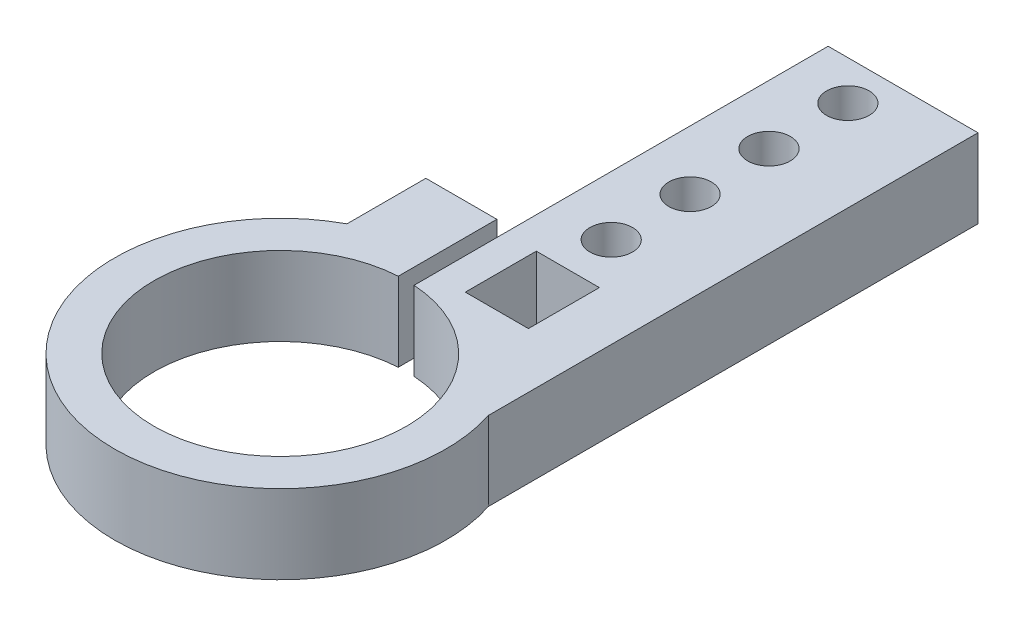
ISO-10303-21;
HEADER;
FILE_DESCRIPTION(('STEP AP214'),'2;1');
FILE_NAME('part.step','',(''),(''),'','','');
FILE_SCHEMA(('AUTOMOTIVE_DESIGN { 1 0 10303 214 1 1 1 1 }'));
ENDSEC;
DATA;
#1=APPLICATION_CONTEXT('core data for automotive mechanical design processes');
#2=APPLICATION_PROTOCOL_DEFINITION('international standard','automotive_design',2000,#1);
#3=PRODUCT_CONTEXT('',#1,'mechanical');
#4=PRODUCT('Part','Part','',(#3));
#5=PRODUCT_RELATED_PRODUCT_CATEGORY('part','',(#4));
#6=PRODUCT_DEFINITION_FORMATION('','',#4);
#7=PRODUCT_DEFINITION_CONTEXT('part definition',#1,'design');
#8=PRODUCT_DEFINITION('design','',#6,#7);
#9=PRODUCT_DEFINITION_SHAPE('','',#8);
#10=(LENGTH_UNIT() NAMED_UNIT(*) SI_UNIT(.MILLI.,.METRE.));
#11=(NAMED_UNIT(*) PLANE_ANGLE_UNIT() SI_UNIT($,.RADIAN.));
#12=(NAMED_UNIT(*) SI_UNIT($,.STERADIAN.) SOLID_ANGLE_UNIT());
#13=UNCERTAINTY_MEASURE_WITH_UNIT(LENGTH_MEASURE(1.E-05),#10,'distance_accuracy_value','');
#14=(GEOMETRIC_REPRESENTATION_CONTEXT(3) GLOBAL_UNCERTAINTY_ASSIGNED_CONTEXT((#13)) GLOBAL_UNIT_ASSIGNED_CONTEXT((#10,
#11,#12)) REPRESENTATION_CONTEXT('',''));
#15=CARTESIAN_POINT('',(0.,0.,0.));
#16=DIRECTION('',(0.,0.,1.));
#17=DIRECTION('',(1.,0.,0.));
#18=AXIS2_PLACEMENT_3D('',#15,#16,#17);
#19=CARTESIAN_POINT('',(0.,12.7,0.));
#20=DIRECTION('',(0.,-1.,0.));
#21=DIRECTION('',(0.,0.,-1.));
#22=AXIS2_PLACEMENT_3D('',#19,#20,#21);
#23=CYLINDRICAL_SURFACE('',#22,26.67);
#24=DIRECTION('',(0.,-1.,0.));
#25=VECTOR('',#24,1.);
#26=CARTESIAN_POINT('',(25.4,12.7,-8.13196778153974));
#27=LINE('',#26,#25);
#28=CARTESIAN_POINT('',(25.4,0.,-8.13196778153973));
#29=VERTEX_POINT('',#28);
#30=CARTESIAN_POINT('',(25.4,12.7,-8.13196778153973));
#31=VERTEX_POINT('',#30);
#32=EDGE_CURVE('E175',#29,#31,#27,.F.);
#33=ORIENTED_EDGE('',*,*,#32,.T.);
#34=CARTESIAN_POINT('',(0.,12.7,0.));
#35=DIRECTION('',(0.,1.,0.));
#36=DIRECTION('',(0.,0.,1.));
#37=AXIS2_PLACEMENT_3D('',#34,#35,#36);
#38=CIRCLE('',#37,26.67);
#39=CARTESIAN_POINT('',(-12.7,12.7,-23.4520553470266));
#40=VERTEX_POINT('',#39);
#41=EDGE_CURVE('E40',#40,#31,#38,.T.);
#42=ORIENTED_EDGE('',*,*,#41,.F.);
#43=DIRECTION('',(0.,-1.,0.));
#44=VECTOR('',#43,1.);
#45=CARTESIAN_POINT('',(-12.7,12.7,-23.4520553470266));
#46=LINE('',#45,#44);
#47=CARTESIAN_POINT('',(-12.7,0.,-23.4520553470266));
#48=VERTEX_POINT('',#47);
#49=EDGE_CURVE('E212',#40,#48,#46,.T.);
#50=ORIENTED_EDGE('',*,*,#49,.T.);
#51=CARTESIAN_POINT('',(0.,0.,0.));
#52=DIRECTION('',(0.,1.,0.));
#53=DIRECTION('',(0.,0.,1.));
#54=AXIS2_PLACEMENT_3D('',#51,#52,#53);
#55=CIRCLE('',#54,26.67);
#56=EDGE_CURVE('E219',#48,#29,#55,.T.);
#57=ORIENTED_EDGE('',*,*,#56,.T.);
#58=EDGE_LOOP('',(#33,#42,#50,#57));
#59=FACE_BOUND('',#58,.T.);
#60=ADVANCED_FACE('F33',(#59),#23,.T.);
#61=CARTESIAN_POINT('',(0.,12.7,0.));
#62=DIRECTION('',(0.,1.,0.));
#63=DIRECTION('',(0.,0.,1.));
#64=AXIS2_PLACEMENT_3D('',#61,#62,#63);
#65=PLANE('',#64);
#66=CARTESIAN_POINT('',(10.7950000000001,12.7,-67.9020553470266));
#67=DIRECTION('',(0.,1.,0.));
#68=DIRECTION('',(0.,0.,1.));
#69=AXIS2_PLACEMENT_3D('',#66,#67,#68);
#70=CIRCLE('',#69,3.42900000000001);
#71=CARTESIAN_POINT('',(10.7950000000001,12.7,-64.4730553470266));
#72=VERTEX_POINT('',#71);
#73=EDGE_CURVE('E150',#72,#72,#70,.T.);
#74=ORIENTED_EDGE('',*,*,#73,.F.);
#75=EDGE_LOOP('',(#74));
#76=FACE_BOUND('',#75,.T.);
#77=DIRECTION('',(1.,0.,0.));
#78=VECTOR('',#77,1.);
#79=CARTESIAN_POINT('',(6.35,12.7,-23.4520553470266));
#80=LINE('',#79,#78);
#81=CARTESIAN_POINT('',(6.35,12.7,-23.4520553470266));
#82=VERTEX_POINT('',#81);
#83=CARTESIAN_POINT('',(16.51,12.7,-23.4520553470266));
#84=VERTEX_POINT('',#83);
#85=EDGE_CURVE('E128',#82,#84,#80,.T.);
#86=ORIENTED_EDGE('',*,*,#85,.F.);
#87=DIRECTION('',(0.,0.,1.));
#88=VECTOR('',#87,1.);
#89=CARTESIAN_POINT('',(6.35,12.7,-34.8820553470266));
#90=LINE('',#89,#88);
#91=CARTESIAN_POINT('',(6.35,12.7,-34.8820553470266));
#92=VERTEX_POINT('',#91);
#93=EDGE_CURVE('E120',#92,#82,#90,.T.);
#94=ORIENTED_EDGE('',*,*,#93,.F.);
#95=DIRECTION('',(-1.,0.,0.));
#96=VECTOR('',#95,1.);
#97=CARTESIAN_POINT('',(6.35,12.7,-34.8820553470266));
#98=LINE('',#97,#96);
#99=CARTESIAN_POINT('',(16.51,12.7,-34.8820553470266));
#100=VERTEX_POINT('',#99);
#101=EDGE_CURVE('E144',#100,#92,#98,.T.);
#102=ORIENTED_EDGE('',*,*,#101,.F.);
#103=DIRECTION('',(0.,0.,-1.));
#104=VECTOR('',#103,1.);
#105=CARTESIAN_POINT('',(16.51,12.7,-34.8820553470266));
#106=LINE('',#105,#104);
#107=EDGE_CURVE('E142',#84,#100,#106,.T.);
#108=ORIENTED_EDGE('',*,*,#107,.F.);
#109=EDGE_LOOP('',(#86,#94,#102,#108));
#110=FACE_BOUND('',#109,.T.);
#111=CARTESIAN_POINT('',(10.7950000000003,12.7,-55.2020553470266));
#112=DIRECTION('',(0.,1.,0.));
#113=DIRECTION('',(0.,0.,1.));
#114=AXIS2_PLACEMENT_3D('',#111,#112,#113);
#115=CIRCLE('',#114,3.42900000000001);
#116=CARTESIAN_POINT('',(10.7950000000003,12.7,-51.7730553470266));
#117=VERTEX_POINT('',#116);
#118=EDGE_CURVE('E416',#117,#117,#115,.T.);
#119=ORIENTED_EDGE('',*,*,#118,.F.);
#120=EDGE_LOOP('',(#119));
#121=FACE_BOUND('',#120,.T.);
#122=CARTESIAN_POINT('',(10.7950000000004,12.7,-42.5020553470266));
#123=DIRECTION('',(0.,1.,0.));
#124=DIRECTION('',(0.,0.,1.));
#125=AXIS2_PLACEMENT_3D('',#122,#123,#124);
#126=CIRCLE('',#125,3.42900000000001);
#127=CARTESIAN_POINT('',(10.7950000000004,12.7,-39.0730553470266));
#128=VERTEX_POINT('',#127);
#129=EDGE_CURVE('E425',#128,#128,#126,.T.);
#130=ORIENTED_EDGE('',*,*,#129,.F.);
#131=EDGE_LOOP('',(#130));
#132=FACE_BOUND('',#131,.T.);
#133=CARTESIAN_POINT('',(10.795,12.7,-80.6020553470266));
#134=DIRECTION('',(0.,1.,0.));
#135=DIRECTION('',(0.,0.,1.));
#136=AXIS2_PLACEMENT_3D('',#133,#134,#135);
#137=CIRCLE('',#136,3.42900000000001);
#138=CARTESIAN_POINT('',(10.795,12.7,-77.1730553470266));
#139=VERTEX_POINT('',#138);
#140=EDGE_CURVE('E160',#139,#139,#137,.T.);
#141=ORIENTED_EDGE('',*,*,#140,.F.);
#142=EDGE_LOOP('',(#141));
#143=FACE_BOUND('',#142,.T.);
#144=ORIENTED_EDGE('',*,*,#41,.T.);
#145=DIRECTION('',(0.,0.,1.));
#146=VECTOR('',#145,1.);
#147=CARTESIAN_POINT('',(25.4,12.7,-36.1520553470266));
#148=LINE('',#147,#146);
#149=CARTESIAN_POINT('',(25.4,12.7,-86.9520553470266));
#150=VERTEX_POINT('',#149);
#151=EDGE_CURVE('E179',#150,#31,#148,.T.);
#152=ORIENTED_EDGE('',*,*,#151,.F.);
#153=DIRECTION('',(-1.,0.,0.));
#154=VECTOR('',#153,1.);
#155=CARTESIAN_POINT('',(25.4,12.7,-86.9520553470266));
#156=LINE('',#155,#154);
#157=CARTESIAN_POINT('',(1.27,12.7,-86.9520553470266));
#158=VERTEX_POINT('',#157);
#159=EDGE_CURVE('E163',#150,#158,#156,.T.);
#160=ORIENTED_EDGE('',*,*,#159,.T.);
#161=DIRECTION('',(0.,0.,-1.));
#162=VECTOR('',#161,1.);
#163=CARTESIAN_POINT('',(1.27,12.7,-1.43164468337886));
#164=LINE('',#163,#162);
#165=CARTESIAN_POINT('',(1.27,12.7,-20.2802736667926));
#166=VERTEX_POINT('',#165);
#167=EDGE_CURVE('E185',#166,#158,#164,.T.);
#168=ORIENTED_EDGE('',*,*,#167,.F.);
#169=CARTESIAN_POINT('',(0.,12.7,0.));
#170=DIRECTION('',(0.,1.,0.));
#171=DIRECTION('',(0.,0.,1.));
#172=AXIS2_PLACEMENT_3D('',#169,#170,#171);
#173=CIRCLE('',#172,20.32);
#174=CARTESIAN_POINT('',(-1.27,12.7,-20.2802736667926));
#175=VERTEX_POINT('',#174);
#176=EDGE_CURVE('E216',#175,#166,#173,.T.);
#177=ORIENTED_EDGE('',*,*,#176,.F.);
#178=DIRECTION('',(0.,0.,1.));
#179=VECTOR('',#178,1.);
#180=CARTESIAN_POINT('',(-1.27,12.7,-1.43164468337886));
#181=LINE('',#180,#179);
#182=CARTESIAN_POINT('',(-1.27,12.7,-36.1520553470266));
#183=VERTEX_POINT('',#182);
#184=EDGE_CURVE('E187',#183,#175,#181,.T.);
#185=ORIENTED_EDGE('',*,*,#184,.F.);
#186=DIRECTION('',(-1.,0.,0.));
#187=VECTOR('',#186,1.);
#188=CARTESIAN_POINT('',(12.7,12.7,-36.1520553470266));
#189=LINE('',#188,#187);
#190=CARTESIAN_POINT('',(-12.7,12.7,-36.1520553470266));
#191=VERTEX_POINT('',#190);
#192=EDGE_CURVE('E203',#183,#191,#189,.T.);
#193=ORIENTED_EDGE('',*,*,#192,.T.);
#194=DIRECTION('',(0.,0.,1.));
#195=VECTOR('',#194,1.);
#196=CARTESIAN_POINT('',(-12.7,12.7,-36.1520553470266));
#197=LINE('',#196,#195);
#198=EDGE_CURVE('E200',#191,#40,#197,.T.);
#199=ORIENTED_EDGE('',*,*,#198,.T.);
#200=EDGE_LOOP('',(#144,#152,#160,#168,#177,#185,#193,#199));
#201=FACE_BOUND('',#200,.T.);
#202=ADVANCED_FACE('F140',(#76,#110,#121,#132,#143,#201),#65,.T.);
#203=CARTESIAN_POINT('',(0.,0.,0.));
#204=DIRECTION('',(0.,1.,0.));
#205=DIRECTION('',(0.,0.,1.));
#206=AXIS2_PLACEMENT_3D('',#203,#204,#205);
#207=PLANE('',#206);
#208=CARTESIAN_POINT('',(10.7950000000001,0.,-67.9020553470266));
#209=DIRECTION('',(0.,1.,0.));
#210=DIRECTION('',(0.,0.,1.));
#211=AXIS2_PLACEMENT_3D('',#208,#209,#210);
#212=CIRCLE('',#211,3.42900000000001);
#213=CARTESIAN_POINT('',(10.7950000000001,0.,-64.4730553470266));
#214=VERTEX_POINT('',#213);
#215=EDGE_CURVE('E415',#214,#214,#212,.T.);
#216=ORIENTED_EDGE('',*,*,#215,.T.);
#217=EDGE_LOOP('',(#216));
#218=FACE_BOUND('',#217,.T.);
#219=DIRECTION('',(0.,0.,1.));
#220=VECTOR('',#219,1.);
#221=CARTESIAN_POINT('',(6.35,0.,-34.8820553470266));
#222=LINE('',#221,#220);
#223=CARTESIAN_POINT('',(6.35,0.,-34.8820553470266));
#224=VERTEX_POINT('',#223);
#225=CARTESIAN_POINT('',(6.35,0.,-23.4520553470266));
#226=VERTEX_POINT('',#225);
#227=EDGE_CURVE('E55',#224,#226,#222,.T.);
#228=ORIENTED_EDGE('',*,*,#227,.T.);
#229=DIRECTION('',(1.,0.,0.));
#230=VECTOR('',#229,1.);
#231=CARTESIAN_POINT('',(6.35,0.,-23.4520553470266));
#232=LINE('',#231,#230);
#233=CARTESIAN_POINT('',(16.51,0.,-23.4520553470266));
#234=VERTEX_POINT('',#233);
#235=EDGE_CURVE('E135',#226,#234,#232,.T.);
#236=ORIENTED_EDGE('',*,*,#235,.T.);
#237=DIRECTION('',(0.,0.,-1.));
#238=VECTOR('',#237,1.);
#239=CARTESIAN_POINT('',(16.51,0.,-34.8820553470266));
#240=LINE('',#239,#238);
#241=CARTESIAN_POINT('',(16.51,0.,-34.8820553470266));
#242=VERTEX_POINT('',#241);
#243=EDGE_CURVE('E152',#234,#242,#240,.T.);
#244=ORIENTED_EDGE('',*,*,#243,.T.);
#245=DIRECTION('',(-1.,0.,0.));
#246=VECTOR('',#245,1.);
#247=CARTESIAN_POINT('',(6.35,0.,-34.8820553470266));
#248=LINE('',#247,#246);
#249=EDGE_CURVE('E129',#242,#224,#248,.T.);
#250=ORIENTED_EDGE('',*,*,#249,.T.);
#251=EDGE_LOOP('',(#228,#236,#244,#250));
#252=FACE_BOUND('',#251,.T.);
#253=CARTESIAN_POINT('',(10.7950000000003,0.,-55.2020553470266));
#254=DIRECTION('',(0.,1.,0.));
#255=DIRECTION('',(0.,0.,1.));
#256=AXIS2_PLACEMENT_3D('',#253,#254,#255);
#257=CIRCLE('',#256,3.42900000000001);
#258=CARTESIAN_POINT('',(10.7950000000003,0.,-51.7730553470266));
#259=VERTEX_POINT('',#258);
#260=EDGE_CURVE('E419',#259,#259,#257,.T.);
#261=ORIENTED_EDGE('',*,*,#260,.T.);
#262=EDGE_LOOP('',(#261));
#263=FACE_BOUND('',#262,.T.);
#264=CARTESIAN_POINT('',(10.7950000000004,0.,-42.5020553470266));
#265=DIRECTION('',(0.,1.,0.));
#266=DIRECTION('',(0.,0.,1.));
#267=AXIS2_PLACEMENT_3D('',#264,#265,#266);
#268=CIRCLE('',#267,3.42900000000001);
#269=CARTESIAN_POINT('',(10.7950000000004,0.,-39.0730553470266));
#270=VERTEX_POINT('',#269);
#271=EDGE_CURVE('E422',#270,#270,#268,.T.);
#272=ORIENTED_EDGE('',*,*,#271,.T.);
#273=EDGE_LOOP('',(#272));
#274=FACE_BOUND('',#273,.T.);
#275=CARTESIAN_POINT('',(10.795,0.,-80.6020553470266));
#276=DIRECTION('',(0.,1.,0.));
#277=DIRECTION('',(0.,0.,1.));
#278=AXIS2_PLACEMENT_3D('',#275,#276,#277);
#279=CIRCLE('',#278,3.42900000000001);
#280=CARTESIAN_POINT('',(10.795,0.,-77.1730553470266));
#281=VERTEX_POINT('',#280);
#282=EDGE_CURVE('E136',#281,#281,#279,.T.);
#283=ORIENTED_EDGE('',*,*,#282,.T.);
#284=EDGE_LOOP('',(#283));
#285=FACE_BOUND('',#284,.T.);
#286=DIRECTION('',(0.,0.,-1.));
#287=VECTOR('',#286,1.);
#288=CARTESIAN_POINT('',(1.27,0.,-1.43164468337886));
#289=LINE('',#288,#287);
#290=CARTESIAN_POINT('',(1.27,0.,-20.2802736667926));
#291=VERTEX_POINT('',#290);
#292=CARTESIAN_POINT('',(1.27,0.,-86.9520553470266));
#293=VERTEX_POINT('',#292);
#294=EDGE_CURVE('E184',#291,#293,#289,.T.);
#295=ORIENTED_EDGE('',*,*,#294,.T.);
#296=DIRECTION('',(-1.,0.,0.));
#297=VECTOR('',#296,1.);
#298=CARTESIAN_POINT('',(25.4,0.,-86.9520553470266));
#299=LINE('',#298,#297);
#300=CARTESIAN_POINT('',(25.4,0.,-86.9520553470266));
#301=VERTEX_POINT('',#300);
#302=EDGE_CURVE('E166',#301,#293,#299,.T.);
#303=ORIENTED_EDGE('',*,*,#302,.F.);
#304=DIRECTION('',(0.,0.,-1.));
#305=VECTOR('',#304,1.);
#306=CARTESIAN_POINT('',(25.4,0.,-36.1520553470266));
#307=LINE('',#306,#305);
#308=EDGE_CURVE('E182',#29,#301,#307,.T.);
#309=ORIENTED_EDGE('',*,*,#308,.F.);
#310=ORIENTED_EDGE('',*,*,#56,.F.);
#311=DIRECTION('',(0.,0.,1.));
#312=VECTOR('',#311,1.);
#313=CARTESIAN_POINT('',(-12.7,0.,-36.1520553470266));
#314=LINE('',#313,#312);
#315=CARTESIAN_POINT('',(-12.7,0.,-36.1520553470266));
#316=VERTEX_POINT('',#315);
#317=EDGE_CURVE('E199',#316,#48,#314,.T.);
#318=ORIENTED_EDGE('',*,*,#317,.F.);
#319=DIRECTION('',(-1.,0.,0.));
#320=VECTOR('',#319,1.);
#321=CARTESIAN_POINT('',(12.7,0.,-36.1520553470266));
#322=LINE('',#321,#320);
#323=CARTESIAN_POINT('',(-1.27,0.,-36.1520553470266));
#324=VERTEX_POINT('',#323);
#325=EDGE_CURVE('E204',#324,#316,#322,.T.);
#326=ORIENTED_EDGE('',*,*,#325,.F.);
#327=DIRECTION('',(0.,0.,1.));
#328=VECTOR('',#327,1.);
#329=CARTESIAN_POINT('',(-1.27,0.,-1.43164468337886));
#330=LINE('',#329,#328);
#331=CARTESIAN_POINT('',(-1.27,0.,-20.2802736667926));
#332=VERTEX_POINT('',#331);
#333=EDGE_CURVE('E188',#324,#332,#330,.T.);
#334=ORIENTED_EDGE('',*,*,#333,.T.);
#335=CARTESIAN_POINT('',(0.,0.,0.));
#336=DIRECTION('',(0.,1.,0.));
#337=DIRECTION('',(0.,0.,1.));
#338=AXIS2_PLACEMENT_3D('',#335,#336,#337);
#339=CIRCLE('',#338,20.32);
#340=EDGE_CURVE('E215',#332,#291,#339,.T.);
#341=ORIENTED_EDGE('',*,*,#340,.T.);
#342=EDGE_LOOP('',(#295,#303,#309,#310,#318,#326,#334,#341));
#343=FACE_BOUND('',#342,.T.);
#344=ADVANCED_FACE('F233',(#218,#252,#263,#274,#285,#343),#207,.F.);
#345=CARTESIAN_POINT('',(0.,12.7,0.));
#346=DIRECTION('',(0.,-1.,0.));
#347=DIRECTION('',(0.,0.,-1.));
#348=AXIS2_PLACEMENT_3D('',#345,#346,#347);
#349=CYLINDRICAL_SURFACE('',#348,20.32);
#350=ORIENTED_EDGE('',*,*,#176,.T.);
#351=DIRECTION('',(0.,-1.,0.));
#352=VECTOR('',#351,1.);
#353=CARTESIAN_POINT('',(1.27,12.7,-20.2802736667926));
#354=LINE('',#353,#352);
#355=EDGE_CURVE('E196',#166,#291,#354,.T.);
#356=ORIENTED_EDGE('',*,*,#355,.T.);
#357=ORIENTED_EDGE('',*,*,#340,.F.);
#358=DIRECTION('',(0.,-1.,0.));
#359=VECTOR('',#358,1.);
#360=CARTESIAN_POINT('',(-1.27,12.7,-20.2802736667926));
#361=LINE('',#360,#359);
#362=EDGE_CURVE('E190',#332,#175,#361,.F.);
#363=ORIENTED_EDGE('',*,*,#362,.T.);
#364=EDGE_LOOP('',(#350,#356,#357,#363));
#365=FACE_BOUND('',#364,.T.);
#366=ADVANCED_FACE('F255',(#365),#349,.F.);
#367=CARTESIAN_POINT('',(12.7,12.7,-36.1520553470266));
#368=DIRECTION('',(0.,0.,1.));
#369=DIRECTION('',(1.,0.,0.));
#370=AXIS2_PLACEMENT_3D('',#367,#368,#369);
#371=PLANE('',#370);
#372=DIRECTION('',(0.,1.,0.));
#373=VECTOR('',#372,1.);
#374=CARTESIAN_POINT('',(-1.27,12.7,-36.1520553470266));
#375=LINE('',#374,#373);
#376=EDGE_CURVE('E11',#324,#183,#375,.T.);
#377=ORIENTED_EDGE('',*,*,#376,.F.);
#378=ORIENTED_EDGE('',*,*,#325,.T.);
#379=DIRECTION('',(0.,-1.,0.));
#380=VECTOR('',#379,1.);
#381=CARTESIAN_POINT('',(-12.7,12.7,-36.1520553470266));
#382=LINE('',#381,#380);
#383=EDGE_CURVE('E206',#191,#316,#382,.T.);
#384=ORIENTED_EDGE('',*,*,#383,.F.);
#385=ORIENTED_EDGE('',*,*,#192,.F.);
#386=EDGE_LOOP('',(#377,#378,#384,#385));
#387=FACE_BOUND('',#386,.T.);
#388=ADVANCED_FACE('F251',(#387),#371,.F.);
#389=CARTESIAN_POINT('',(-12.7,12.7,-36.1520553470266));
#390=DIRECTION('',(1.,0.,0.));
#391=DIRECTION('',(0.,0.,-1.));
#392=AXIS2_PLACEMENT_3D('',#389,#390,#391);
#393=PLANE('',#392);
#394=ORIENTED_EDGE('',*,*,#317,.T.);
#395=ORIENTED_EDGE('',*,*,#49,.F.);
#396=ORIENTED_EDGE('',*,*,#198,.F.);
#397=ORIENTED_EDGE('',*,*,#383,.T.);
#398=EDGE_LOOP('',(#394,#395,#396,#397));
#399=FACE_BOUND('',#398,.T.);
#400=ADVANCED_FACE('F246',(#399),#393,.F.);
#401=CARTESIAN_POINT('',(-1.27,12.7,-1.43164468337886));
#402=DIRECTION('',(1.,0.,0.));
#403=DIRECTION('',(0.,0.,-1.));
#404=AXIS2_PLACEMENT_3D('',#401,#402,#403);
#405=PLANE('',#404);
#406=ORIENTED_EDGE('',*,*,#333,.F.);
#407=ORIENTED_EDGE('',*,*,#376,.T.);
#408=ORIENTED_EDGE('',*,*,#184,.T.);
#409=ORIENTED_EDGE('',*,*,#362,.F.);
#410=EDGE_LOOP('',(#406,#407,#408,#409));
#411=FACE_BOUND('',#410,.T.);
#412=ADVANCED_FACE('F253',(#411),#405,.T.);
#413=CARTESIAN_POINT('',(1.27,12.7,-1.43164468337886));
#414=DIRECTION('',(-1.,0.,0.));
#415=DIRECTION('',(0.,0.,1.));
#416=AXIS2_PLACEMENT_3D('',#413,#414,#415);
#417=PLANE('',#416);
#418=ORIENTED_EDGE('',*,*,#167,.T.);
#419=DIRECTION('',(0.,1.,0.));
#420=VECTOR('',#419,1.);
#421=CARTESIAN_POINT('',(1.27,0.,-86.9520553470266));
#422=LINE('',#421,#420);
#423=EDGE_CURVE('E172',#293,#158,#422,.T.);
#424=ORIENTED_EDGE('',*,*,#423,.F.);
#425=ORIENTED_EDGE('',*,*,#294,.F.);
#426=ORIENTED_EDGE('',*,*,#355,.F.);
#427=EDGE_LOOP('',(#418,#424,#425,#426));
#428=FACE_BOUND('',#427,.T.);
#429=ADVANCED_FACE('F257',(#428),#417,.T.);
#430=CARTESIAN_POINT('',(25.4,0.,0.));
#431=DIRECTION('',(-1.,0.,0.));
#432=DIRECTION('',(0.,0.,1.));
#433=AXIS2_PLACEMENT_3D('',#430,#431,#432);
#434=PLANE('',#433);
#435=ORIENTED_EDGE('',*,*,#32,.F.);
#436=ORIENTED_EDGE('',*,*,#308,.T.);
#437=DIRECTION('',(0.,1.,0.));
#438=VECTOR('',#437,1.);
#439=CARTESIAN_POINT('',(25.4,0.,-86.9520553470266));
#440=LINE('',#439,#438);
#441=EDGE_CURVE('E169',#301,#150,#440,.T.);
#442=ORIENTED_EDGE('',*,*,#441,.T.);
#443=ORIENTED_EDGE('',*,*,#151,.T.);
#444=EDGE_LOOP('',(#435,#436,#442,#443));
#445=FACE_BOUND('',#444,.T.);
#446=ADVANCED_FACE('F230',(#445),#434,.F.);
#447=CARTESIAN_POINT('',(25.4,0.,-86.9520553470266));
#448=DIRECTION('',(0.,0.,-1.));
#449=DIRECTION('',(-1.,0.,0.));
#450=AXIS2_PLACEMENT_3D('',#447,#448,#449);
#451=PLANE('',#450);
#452=ORIENTED_EDGE('',*,*,#159,.F.);
#453=ORIENTED_EDGE('',*,*,#441,.F.);
#454=ORIENTED_EDGE('',*,*,#302,.T.);
#455=ORIENTED_EDGE('',*,*,#423,.T.);
#456=EDGE_LOOP('',(#452,#453,#454,#455));
#457=FACE_BOUND('',#456,.T.);
#458=ADVANCED_FACE('F237',(#457),#451,.T.);
#459=CARTESIAN_POINT('',(10.795,12.7,-80.6020553470266));
#460=DIRECTION('',(0.,-1.,0.));
#461=DIRECTION('',(0.,0.,-1.));
#462=AXIS2_PLACEMENT_3D('',#459,#460,#461);
#463=CYLINDRICAL_SURFACE('',#462,3.42900000000001);
#464=ORIENTED_EDGE('',*,*,#140,.T.);
#465=EDGE_LOOP('',(#464));
#466=FACE_BOUND('',#465,.T.);
#467=ORIENTED_EDGE('',*,*,#282,.F.);
#468=EDGE_LOOP('',(#467));
#469=FACE_BOUND('',#468,.T.);
#470=ADVANCED_FACE('F322',(#466,#469),#463,.F.);
#471=CARTESIAN_POINT('',(10.7950000000004,12.7,-42.5020553470266));
#472=DIRECTION('',(0.,-1.,0.));
#473=DIRECTION('',(0.,0.,-1.));
#474=AXIS2_PLACEMENT_3D('',#471,#472,#473);
#475=CYLINDRICAL_SURFACE('',#474,3.42900000000001);
#476=ORIENTED_EDGE('',*,*,#129,.T.);
#477=EDGE_LOOP('',(#476));
#478=FACE_BOUND('',#477,.T.);
#479=ORIENTED_EDGE('',*,*,#271,.F.);
#480=EDGE_LOOP('',(#479));
#481=FACE_BOUND('',#480,.T.);
#482=ADVANCED_FACE('F342',(#478,#481),#475,.F.);
#483=CARTESIAN_POINT('',(10.7950000000003,12.7,-55.2020553470266));
#484=DIRECTION('',(0.,-1.,0.));
#485=DIRECTION('',(0.,0.,-1.));
#486=AXIS2_PLACEMENT_3D('',#483,#484,#485);
#487=CYLINDRICAL_SURFACE('',#486,3.42900000000001);
#488=ORIENTED_EDGE('',*,*,#118,.T.);
#489=EDGE_LOOP('',(#488));
#490=FACE_BOUND('',#489,.T.);
#491=ORIENTED_EDGE('',*,*,#260,.F.);
#492=EDGE_LOOP('',(#491));
#493=FACE_BOUND('',#492,.T.);
#494=ADVANCED_FACE('F352',(#490,#493),#487,.F.);
#495=CARTESIAN_POINT('',(6.35,12.7,-34.8820553470266));
#496=DIRECTION('',(1.,0.,0.));
#497=DIRECTION('',(0.,0.,-1.));
#498=AXIS2_PLACEMENT_3D('',#495,#496,#497);
#499=PLANE('',#498);
#500=ORIENTED_EDGE('',*,*,#227,.F.);
#501=DIRECTION('',(0.,-1.,0.));
#502=VECTOR('',#501,1.);
#503=CARTESIAN_POINT('',(6.35,12.7,-34.8820553470266));
#504=LINE('',#503,#502);
#505=EDGE_CURVE('E124',#92,#224,#504,.T.);
#506=ORIENTED_EDGE('',*,*,#505,.F.);
#507=ORIENTED_EDGE('',*,*,#93,.T.);
#508=DIRECTION('',(0.,-1.,0.));
#509=VECTOR('',#508,1.);
#510=CARTESIAN_POINT('',(6.35,12.7,-23.4520553470266));
#511=LINE('',#510,#509);
#512=EDGE_CURVE('E123',#82,#226,#511,.T.);
#513=ORIENTED_EDGE('',*,*,#512,.T.);
#514=EDGE_LOOP('',(#500,#506,#507,#513));
#515=FACE_BOUND('',#514,.T.);
#516=ADVANCED_FACE('F122',(#515),#499,.T.);
#517=CARTESIAN_POINT('',(6.35,12.7,-23.4520553470266));
#518=DIRECTION('',(0.,0.,-1.));
#519=DIRECTION('',(-1.,0.,0.));
#520=AXIS2_PLACEMENT_3D('',#517,#518,#519);
#521=PLANE('',#520);
#522=ORIENTED_EDGE('',*,*,#235,.F.);
#523=ORIENTED_EDGE('',*,*,#512,.F.);
#524=ORIENTED_EDGE('',*,*,#85,.T.);
#525=DIRECTION('',(0.,-1.,0.));
#526=VECTOR('',#525,1.);
#527=CARTESIAN_POINT('',(16.51,12.7,-23.4520553470266));
#528=LINE('',#527,#526);
#529=EDGE_CURVE('E137',#84,#234,#528,.T.);
#530=ORIENTED_EDGE('',*,*,#529,.T.);
#531=EDGE_LOOP('',(#522,#523,#524,#530));
#532=FACE_BOUND('',#531,.T.);
#533=ADVANCED_FACE('F132',(#532),#521,.T.);
#534=CARTESIAN_POINT('',(16.51,12.7,-34.8820553470266));
#535=DIRECTION('',(-1.,0.,0.));
#536=DIRECTION('',(0.,0.,1.));
#537=AXIS2_PLACEMENT_3D('',#534,#535,#536);
#538=PLANE('',#537);
#539=ORIENTED_EDGE('',*,*,#243,.F.);
#540=ORIENTED_EDGE('',*,*,#529,.F.);
#541=ORIENTED_EDGE('',*,*,#107,.T.);
#542=DIRECTION('',(0.,-1.,0.));
#543=VECTOR('',#542,1.);
#544=CARTESIAN_POINT('',(16.51,12.7,-34.8820553470266));
#545=LINE('',#544,#543);
#546=EDGE_CURVE('E47',#100,#242,#545,.T.);
#547=ORIENTED_EDGE('',*,*,#546,.T.);
#548=EDGE_LOOP('',(#539,#540,#541,#547));
#549=FACE_BOUND('',#548,.T.);
#550=ADVANCED_FACE('F379',(#549),#538,.T.);
#551=CARTESIAN_POINT('',(6.35,12.7,-34.8820553470266));
#552=DIRECTION('',(0.,0.,1.));
#553=DIRECTION('',(1.,0.,0.));
#554=AXIS2_PLACEMENT_3D('',#551,#552,#553);
#555=PLANE('',#554);
#556=ORIENTED_EDGE('',*,*,#249,.F.);
#557=ORIENTED_EDGE('',*,*,#546,.F.);
#558=ORIENTED_EDGE('',*,*,#101,.T.);
#559=ORIENTED_EDGE('',*,*,#505,.T.);
#560=EDGE_LOOP('',(#556,#557,#558,#559));
#561=FACE_BOUND('',#560,.T.);
#562=ADVANCED_FACE('F388',(#561),#555,.T.);
#563=CARTESIAN_POINT('',(10.7950000000001,12.7,-67.9020553470266));
#564=DIRECTION('',(0.,-1.,0.));
#565=DIRECTION('',(0.,0.,-1.));
#566=AXIS2_PLACEMENT_3D('',#563,#564,#565);
#567=CYLINDRICAL_SURFACE('',#566,3.42900000000001);
#568=ORIENTED_EDGE('',*,*,#73,.T.);
#569=EDGE_LOOP('',(#568));
#570=FACE_BOUND('',#569,.T.);
#571=ORIENTED_EDGE('',*,*,#215,.F.);
#572=EDGE_LOOP('',(#571));
#573=FACE_BOUND('',#572,.T.);
#574=ADVANCED_FACE('F398',(#570,#573),#567,.F.);
#575=CLOSED_SHELL('',(#60,#202,#344,#366,#388,#400,#412,#429,#446,#458,#470,#482,#494,#516,#533,
#550,#562,#574));
#576=MANIFOLD_SOLID_BREP('B2',#575);
#577=ADVANCED_BREP_SHAPE_REPRESENTATION('',(#18,#576),#14);
#578=SHAPE_DEFINITION_REPRESENTATION(#9,#577);
ENDSEC;
END-ISO-10303-21;
